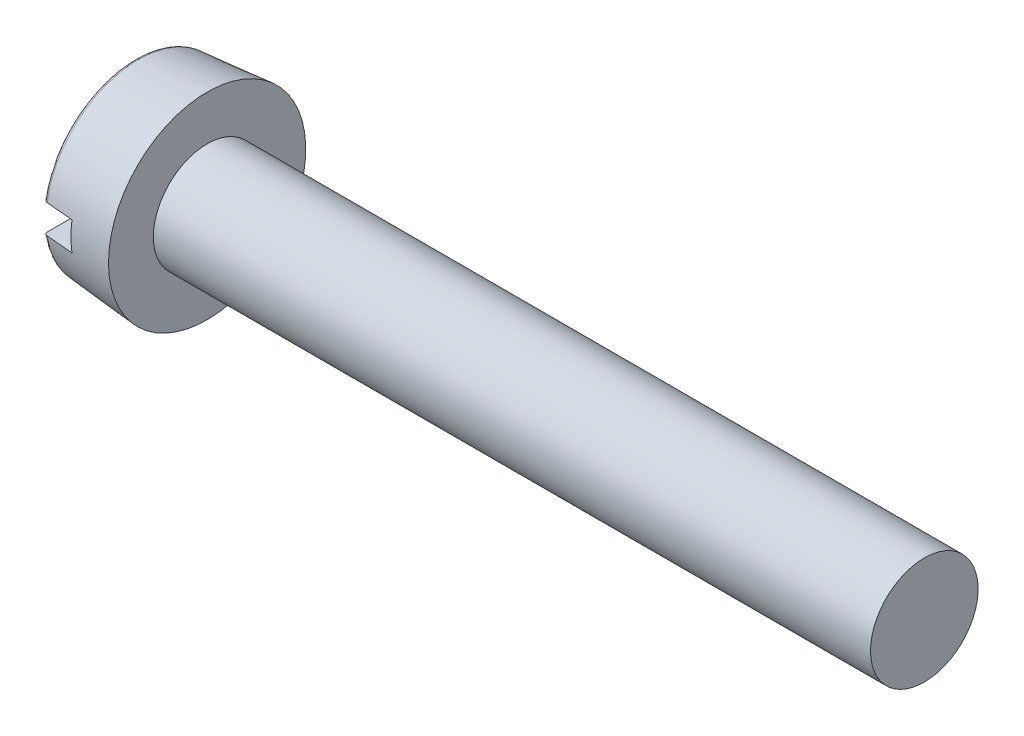
ISO-10303-21;
HEADER;
FILE_DESCRIPTION(('STEP AP214'),'2;1');
FILE_NAME('part.step','',(''),(''),'','','');
FILE_SCHEMA(('AUTOMOTIVE_DESIGN { 1 0 10303 214 1 1 1 1 }'));
ENDSEC;
DATA;
#1=APPLICATION_CONTEXT('core data for automotive mechanical design processes');
#2=APPLICATION_PROTOCOL_DEFINITION('international standard','automotive_design',2000,#1);
#3=PRODUCT_CONTEXT('',#1,'mechanical');
#4=PRODUCT('Part','Part','',(#3));
#5=PRODUCT_RELATED_PRODUCT_CATEGORY('part','',(#4));
#6=PRODUCT_DEFINITION_FORMATION('','',#4);
#7=PRODUCT_DEFINITION_CONTEXT('part definition',#1,'design');
#8=PRODUCT_DEFINITION('design','',#6,#7);
#9=PRODUCT_DEFINITION_SHAPE('','',#8);
#10=(LENGTH_UNIT() NAMED_UNIT(*) SI_UNIT(.MILLI.,.METRE.));
#11=(NAMED_UNIT(*) PLANE_ANGLE_UNIT() SI_UNIT($,.RADIAN.));
#12=(NAMED_UNIT(*) SI_UNIT($,.STERADIAN.) SOLID_ANGLE_UNIT());
#13=UNCERTAINTY_MEASURE_WITH_UNIT(LENGTH_MEASURE(1.E-05),#10,'distance_accuracy_value','');
#14=(GEOMETRIC_REPRESENTATION_CONTEXT(3) GLOBAL_UNCERTAINTY_ASSIGNED_CONTEXT((#13)) GLOBAL_UNIT_ASSIGNED_CONTEXT((#10,
#11,#12)) REPRESENTATION_CONTEXT('',''));
#15=CARTESIAN_POINT('',(0.,0.,0.));
#16=DIRECTION('',(0.,0.,1.));
#17=DIRECTION('',(1.,0.,0.));
#18=AXIS2_PLACEMENT_3D('',#15,#16,#17);
#19=CARTESIAN_POINT('',(0.,0.,0.));
#20=DIRECTION('',(-1.,0.,0.));
#21=DIRECTION('',(0.,0.,1.));
#22=AXIS2_PLACEMENT_3D('',#19,#20,#21);
#23=PLANE('',#22);
#24=DIRECTION('',(0.,0.,-1.));
#25=VECTOR('',#24,1.);
#26=CARTESIAN_POINT('',(0.,0.4,2.75));
#27=LINE('',#26,#25);
#28=CARTESIAN_POINT('',(0.,0.4,2.45096382768025));
#29=VERTEX_POINT('',#28);
#30=CARTESIAN_POINT('',(0.,0.4,-2.45096382768025));
#31=VERTEX_POINT('',#30);
#32=EDGE_CURVE('E84',#29,#31,#27,.T.);
#33=ORIENTED_EDGE('',*,*,#32,.F.);
#34=CARTESIAN_POINT('',(0.,0.,0.));
#35=DIRECTION('',(-1.,0.,0.));
#36=DIRECTION('',(0.,0.,1.));
#37=AXIS2_PLACEMENT_3D('',#34,#35,#36);
#38=CIRCLE('',#37,2.48338955554641);
#39=EDGE_CURVE('E86',#29,#31,#38,.T.);
#40=ORIENTED_EDGE('',*,*,#39,.T.);
#41=EDGE_LOOP('',(#33,#40));
#42=FACE_BOUND('',#41,.T.);
#43=ADVANCED_FACE('F16',(#42),#23,.T.);
#44=CARTESIAN_POINT('',(0.1,0.,0.));
#45=DIRECTION('',(-1.,0.,0.));
#46=DIRECTION('',(0.,0.,1.));
#47=AXIS2_PLACEMENT_3D('',#44,#45,#46);
#48=TOROIDAL_SURFACE('',#47,2.48338955554641,0.1);
#49=CARTESIAN_POINT('',(0.0289938380211766,0.4,-2.52228316549766));
#50=CARTESIAN_POINT('',(0.032914640039902,0.4,-2.52628601737879));
#51=CARTESIAN_POINT('',(0.0371732059087856,0.4,-2.52996330795833));
#52=CARTESIAN_POINT('',(0.0462494374841119,0.4,-2.53655558833691));
#53=CARTESIAN_POINT('',(0.0510676904570532,0.4,-2.53946976679746));
#54=CARTESIAN_POINT('',(0.0611266188974552,0.4,-2.54444525866304));
#55=CARTESIAN_POINT('',(0.0663672780390153,0.4,-2.54650660501096));
#56=CARTESIAN_POINT('',(0.0771205298537036,0.4,-2.54971287140411));
#57=CARTESIAN_POINT('',(0.0826330564249982,0.4,-2.55085801306043));
#58=CARTESIAN_POINT('',(0.0937360108304335,0.4,-2.55219318080891));
#59=CARTESIAN_POINT('',(0.0993256947509513,0.4,-2.55238939597481));
#60=CARTESIAN_POINT('',(0.110458306622039,0.4,-2.55183747650024));
#61=CARTESIAN_POINT('',(0.116001234198318,0.4,-2.55108933430727));
#62=CARTESIAN_POINT('',(0.126865819783631,0.4,-2.54867516285271));
#63=CARTESIAN_POINT('',(0.132188090847036,0.4,-2.54701188972794));
#64=CARTESIAN_POINT('',(0.142479668135714,0.4,-2.54281935144472));
#65=CARTESIAN_POINT('',(0.147448970444547,0.4,-2.54029007667919));
#66=CARTESIAN_POINT('',(0.156919019556884,0.4,-2.53442699567865));
#67=CARTESIAN_POINT('',(0.161417530686885,0.4,-2.53108957986598));
#68=CARTESIAN_POINT('',(0.169797583318729,0.4,-2.52371398467404));
#69=CARTESIAN_POINT('',(0.173679096427556,0.4,-2.51967577306341));
#70=CARTESIAN_POINT('',(0.180758379631839,0.4,-2.51096934806693));
#71=CARTESIAN_POINT('',(0.183948691710374,0.4,-2.50629507144611));
#72=CARTESIAN_POINT('',(0.189510239570672,0.4,-2.49648236653712));
#73=CARTESIAN_POINT('',(0.191881421883503,0.4,-2.49134390797695));
#74=CARTESIAN_POINT('',(0.195767027940458,0.4,-2.480682205207));
#75=CARTESIAN_POINT('',(0.197270760971854,0.4,-2.47515506403468));
#76=CARTESIAN_POINT('',(0.199338128353477,0.4,-2.46392763420021));
#77=CARTESIAN_POINT('',(0.199901709526226,0.4,-2.45822733576239));
#78=CARTESIAN_POINT('',(0.20007548133907,0.4,-2.44676112412241));
#79=CARTESIAN_POINT('',(0.199677113345941,0.4,-2.44099507954687));
#80=CARTESIAN_POINT('',(0.197919889661746,0.4,-2.42961109138142));
#81=CARTESIAN_POINT('',(0.196561010768147,0.4,-2.42399315137259));
#82=CARTESIAN_POINT('',(0.192915627153958,0.4,-2.41305590565846));
#83=CARTESIAN_POINT('',(0.190627555523931,0.4,-2.40773712175832));
#84=CARTESIAN_POINT('',(0.185185000915826,0.4,-2.39756279520368));
#85=CARTESIAN_POINT('',(0.182030540035585,0.4,-2.39270724073845));
#86=CARTESIAN_POINT('',(0.174965864483063,0.4,-2.38363467595376));
#87=CARTESIAN_POINT('',(0.171060998294418,0.4,-2.37941350258364));
#88=CARTESIAN_POINT('',(0.162589830789105,0.4,-2.37169707517616));
#89=CARTESIAN_POINT('',(0.158023574903145,0.4,-2.36820177131907));
#90=CARTESIAN_POINT('',(0.148421596079081,0.4,-2.36208459946197));
#91=CARTESIAN_POINT('',(0.143392636404649,0.4,-2.35945211619945));
#92=CARTESIAN_POINT('',(0.132960042691405,0.4,-2.35508144798975));
#93=CARTESIAN_POINT('',(0.127556438263746,0.4,-2.35334319245586));
#94=CARTESIAN_POINT('',(0.116602502745338,0.4,-2.35083201602087));
#95=CARTESIAN_POINT('',(0.111054942498253,0.4,-2.35004699968965));
#96=CARTESIAN_POINT('',(0.0999070705254333,0.4,-2.3494263065429));
#97=CARTESIAN_POINT('',(0.0943067613611995,0.4,-2.34959058386431));
#98=CARTESIAN_POINT('',(0.0832511443149568,0.4,-2.35085902950957));
#99=CARTESIAN_POINT('',(0.0777951256899433,0.4,-2.3519570180145));
#100=CARTESIAN_POINT('',(0.0671440893672219,0.4,-2.35505088710293));
#101=CARTESIAN_POINT('',(0.0619490721184735,0.4,-2.35704676923085));
#102=CARTESIAN_POINT('',(0.0519500535749679,0.4,-2.36188301447906));
#103=CARTESIAN_POINT('',(0.0471472182076573,0.4,-2.36472578664258));
#104=CARTESIAN_POINT('',(0.0380802947550975,0.4,-2.37116917771983));
#105=CARTESIAN_POINT('',(0.0338162339656361,0.4,-2.37476983500548));
#106=CARTESIAN_POINT('',(0.0258978392798653,0.4,-2.38266730942151));
#107=CARTESIAN_POINT('',(0.0222505790304377,0.4,-2.38697121737475));
#108=CARTESIAN_POINT('',(0.0157188388686001,0.4,-2.39612333377568));
#109=CARTESIAN_POINT('',(0.0128344147286457,0.4,-2.40097158198427));
#110=CARTESIAN_POINT('',(0.00786953684593836,0.4,-2.41114518595604));
#111=CARTESIAN_POINT('',(0.00580049504437296,0.4,-2.41647611188959));
#112=CARTESIAN_POINT('',(0.00257668282239865,0.4,-2.4274074136993));
#113=CARTESIAN_POINT('',(0.00142193421228851,0.4,-2.43300779599991));
#114=CARTESIAN_POINT('',(4.98309082449457E-05,0.4,-2.44437919860998));
#115=CARTESIAN_POINT('',(-0.000158040154989211,0.4,-2.45015136490808));
#116=CARTESIAN_POINT('',(0.000395629680354006,0.4,-2.46165070249477));
#117=CARTESIAN_POINT('',(0.00115743264880565,0.4,-2.46737786119837));
#118=CARTESIAN_POINT('',(0.00363465605126301,0.4,-2.47863907342415));
#119=CARTESIAN_POINT('',(0.00535281370349942,0.4,-2.48417252398631));
#120=CARTESIAN_POINT('',(0.00969850669250341,0.4,-2.49486489969062));
#121=CARTESIAN_POINT('',(0.0123249394519198,0.4,-2.50002426979425));
#122=CARTESIAN_POINT('',(0.0173136943959977,0.4,-2.50805181152184));
#123=CARTESIAN_POINT('',(0.0194300826406187,0.4,-2.51107561025655));
#124=CARTESIAN_POINT('',(0.0239801784125783,0.4,-2.51687431501129));
#125=CARTESIAN_POINT('',(0.0264138847052193,0.4,-2.5196492219997));
#126=CARTESIAN_POINT('',(0.0289938380211766,0.4,-2.52228316549766));
#127=B_SPLINE_CURVE_WITH_KNOTS('',3,(#49,#50,#51,#52,#53,#54,#55,#56,#57,#58,#59,#60,#61,#62,
#63,#64,#65,#66,#67,#68,#69,#70,#71,#72,#73,#74,#75,#76,#77,#78,#79,#80,#81,#82,#83,#84,#85,#86,
#87,#88,#89,#90,#91,#92,#93,#94,#95,#96,#97,#98,#99,#100,#101,#102,#103,#104,#105,#106,#107,
#108,#109,#110,#111,#112,#113,#114,#115,#116,#117,#118,#119,#120,#121,#122,#123,#124,#125,#126),
.UNSPECIFIED.,.T.,.F.,(4,2,2,2,2,2,2,2,2,2,2,2,2,2,2,2,2,2,2,2,2,2,2,2,2,2,2,2,2,2,2,2,2,2,2,2,
2,2,4),(0.,0.0167962438770803,0.0336102736228911,0.0504236538216827,0.0672329659785205,
0.0839324954656507,0.100632158508099,0.117281799647171,0.133931625497133,0.1506572362149,
0.167383616389183,0.184282358747596,0.201182203967945,0.21828610781718,0.235390979075727,
0.25264859529084,0.26990662840296,0.287193885606235,0.304480701927408,0.321648593971807,
0.338815307316333,0.355762112546915,0.372707579860328,0.389435704571818,0.406163021107001,
0.422780481006367,0.439397969489149,0.456063186523277,0.472729247524452,0.48957509386297,
0.506422171494335,0.523497308438321,0.54057285269434,0.557819049576413,0.575069908508115,
0.592370397548949,0.609649958399182,0.620702210843322,0.631754420283979),.UNSPECIFIED.);
#128=CARTESIAN_POINT('',(0.0912844257252334,0.4,-2.5518494518816));
#129=VERTEX_POINT('',#128);
#130=EDGE_CURVE('E40',#31,#129,#127,.T.);
#131=ORIENTED_EDGE('',*,*,#130,.F.);
#132=ORIENTED_EDGE('',*,*,#39,.F.);
#133=CARTESIAN_POINT('',(0.0367676987021641,0.4,2.37243473528728));
#134=CARTESIAN_POINT('',(0.0410691072562519,0.4,2.36887462682049));
#135=CARTESIAN_POINT('',(0.0456712476146376,0.4,2.36567202074306));
#136=CARTESIAN_POINT('',(0.0553504912178815,0.4,2.36008032650184));
#137=CARTESIAN_POINT('',(0.0604280839551126,0.4,2.35769208875703));
#138=CARTESIAN_POINT('',(0.0709135886904194,0.4,2.35380489827384));
#139=CARTESIAN_POINT('',(0.0763214938192328,0.4,2.35230592704897));
#140=CARTESIAN_POINT('',(0.0873116719417476,0.4,2.35024450872371));
#141=CARTESIAN_POINT('',(0.0928939027986413,0.4,2.34968183706536));
#142=CARTESIAN_POINT('',(0.104036601297581,0.4,2.34951039508072));
#143=CARTESIAN_POINT('',(0.109596974662459,0.4,2.34989545024077));
#144=CARTESIAN_POINT('',(0.120573920357346,0.4,2.35159460899385));
#145=CARTESIAN_POINT('',(0.125990490202902,0.4,2.35290872862725));
#146=CARTESIAN_POINT('',(0.13652239124753,0.4,2.35642416504568));
#147=CARTESIAN_POINT('',(0.141637967615106,0.4,2.35862474798459));
#148=CARTESIAN_POINT('',(0.151431222534294,0.4,2.36384674458521));
#149=CARTESIAN_POINT('',(0.156108887376012,0.4,2.3668681839343));
#150=CARTESIAN_POINT('',(0.164936002938918,0.4,2.37367095440966));
#151=CARTESIAN_POINT('',(0.16908079389346,0.4,2.3774583297866));
#152=CARTESIAN_POINT('',(0.176685910750913,0.4,2.38566704388047));
#153=CARTESIAN_POINT('',(0.180146192360979,0.4,2.39008842359028));
#154=CARTESIAN_POINT('',(0.186332746435633,0.4,2.39950205527751));
#155=CARTESIAN_POINT('',(0.189048713902265,0.4,2.40450107962601));
#156=CARTESIAN_POINT('',(0.193614409893134,0.4,2.41488017557624));
#157=CARTESIAN_POINT('',(0.195464077650946,0.4,2.42026027387786));
#158=CARTESIAN_POINT('',(0.19826623133481,0.4,2.43131856240102));
#159=CARTESIAN_POINT('',(0.199207620171234,0.4,2.43699956654937));
#160=CARTESIAN_POINT('',(0.20012925691986,0.4,2.4484391128062));
#161=CARTESIAN_POINT('',(0.200109464431672,0.4,2.45419765816372));
#162=CARTESIAN_POINT('',(0.199105792419158,0.4,2.46566309979117));
#163=CARTESIAN_POINT('',(0.198116473192368,0.4,2.47136952123461));
#164=CARTESIAN_POINT('',(0.195191128966346,0.4,2.48253449565388));
#165=CARTESIAN_POINT('',(0.193255106776879,0.4,2.48799304936533));
#166=CARTESIAN_POINT('',(0.188494675278442,0.4,2.49848893070217));
#167=CARTESIAN_POINT('',(0.185672880951563,0.4,2.50352744366316));
#168=CARTESIAN_POINT('',(0.179215498557441,0.4,2.51305299197626));
#169=CARTESIAN_POINT('',(0.175579948629359,0.4,2.51754005315861));
#170=CARTESIAN_POINT('',(0.167635478825506,0.4,2.52578731588122));
#171=CARTESIAN_POINT('',(0.163333512373972,0.4,2.5295542142048));
#172=CARTESIAN_POINT('',(0.154151555490121,0.4,2.53630156216166));
#173=CARTESIAN_POINT('',(0.149271604711319,0.4,2.53928206570155));
#174=CARTESIAN_POINT('',(0.13913635307135,0.4,2.54433379308572));
#175=CARTESIAN_POINT('',(0.133886369113007,0.4,2.54641568563766));
#176=CARTESIAN_POINT('',(0.123109394747461,0.4,2.54965893225548));
#177=CARTESIAN_POINT('',(0.117582421034199,0.4,2.55082034172732));
#178=CARTESIAN_POINT('',(0.106464698916145,0.4,2.55218028189334));
#179=CARTESIAN_POINT('',(0.100875054594367,0.4,2.55238785185234));
#180=CARTESIAN_POINT('',(0.0897407847209889,0.4,2.55185843737952));
#181=CARTESIAN_POINT('',(0.0841961579348971,0.4,2.55112147893765));
#182=CARTESIAN_POINT('',(0.0733265657266894,0.4,2.54872918263962));
#183=CARTESIAN_POINT('',(0.0680009847337698,0.4,2.54707663871122));
#184=CARTESIAN_POINT('',(0.0577010526378298,0.4,2.54290481605141));
#185=CARTESIAN_POINT('',(0.0527267057044028,0.4,2.54038552703274));
#186=CARTESIAN_POINT('',(0.0432451955154216,0.4,2.53454156724995));
#187=CARTESIAN_POINT('',(0.0387402389480656,0.4,2.53121331773258));
#188=CARTESIAN_POINT('',(0.0303458654217713,0.4,2.52385482922166));
#189=CARTESIAN_POINT('',(0.0264564786942822,0.4,2.51982455577117));
#190=CARTESIAN_POINT('',(0.0193602742266984,0.4,2.51113277232454));
#191=CARTESIAN_POINT('',(0.0161608831052445,0.4,2.50646520000313));
#192=CARTESIAN_POINT('',(0.0105801862776831,0.4,2.49666430232761));
#193=CARTESIAN_POINT('',(0.0081989347764834,0.4,2.491530946142));
#194=CARTESIAN_POINT('',(0.00429230007908613,0.4,2.48087765570879));
#195=CARTESIAN_POINT('',(0.00277761888662436,0.4,2.47535379620009));
#196=CARTESIAN_POINT('',(0.000687995440566799,0.4,2.46413127035624));
#197=CARTESIAN_POINT('',(0.0001130708922124,0.4,2.45843260072968));
#198=CARTESIAN_POINT('',(-8.37002456024794E-05,0.4,2.44696818040157));
#199=CARTESIAN_POINT('',(0.000302941335767494,0.4,2.44120228266165));
#200=CARTESIAN_POINT('',(0.00203701001733551,0.4,2.42981508207598));
#201=CARTESIAN_POINT('',(0.00338469494754019,0.4,2.42419381845226));
#202=CARTESIAN_POINT('',(0.00700896577894959,0.4,2.41324562761761));
#203=CARTESIAN_POINT('',(0.00928760515722993,0.4,2.40791938083122));
#204=CARTESIAN_POINT('',(0.0147114792186618,0.4,2.39773348978099));
#205=CARTESIAN_POINT('',(0.0178556585516143,0.4,2.39287328693997));
#206=CARTESIAN_POINT('',(0.0236503626604919,0.4,2.38539954815907));
#207=CARTESIAN_POINT('',(0.0260726096208587,0.4,2.38260604033144));
#208=CARTESIAN_POINT('',(0.031208607808559,0.4,2.37730112356));
#209=CARTESIAN_POINT('',(0.0339223576900257,0.4,2.37478971331387));
#210=CARTESIAN_POINT('',(0.0367676987021641,0.4,2.37243473528728));
#211=B_SPLINE_CURVE_WITH_KNOTS('',3,(#133,#134,#135,#136,#137,#138,#139,#140,#141,#142,#143,
#144,#145,#146,#147,#148,#149,#150,#151,#152,#153,#154,#155,#156,#157,#158,#159,#160,#161,#162,
#163,#164,#165,#166,#167,#168,#169,#170,#171,#172,#173,#174,#175,#176,#177,#178,#179,#180,#181,
#182,#183,#184,#185,#186,#187,#188,#189,#190,#191,#192,#193,#194,#195,#196,#197,#198,#199,#200,
#201,#202,#203,#204,#205,#206,#207,#208,#209,#210),.UNSPECIFIED.,.T.,.F.,(4,2,2,2,2,2,2,2,2,2,2,
2,2,2,2,2,2,2,2,2,2,2,2,2,2,2,2,2,2,2,2,2,2,2,2,2,2,2,4),(0.,0.0167374978406363,
0.0334924209723814,0.0502469957829498,0.0669975516708034,0.0836392656129628,0.100281266882442,
0.116909519525705,0.133538292583204,0.15030380318579,0.167070398286949,0.184058579715982,
0.20104795259929,0.218242362613188,0.235437495343467,0.252729660021827,0.270021773378245,
0.287263309496308,0.304504037705845,0.321575685446242,0.338646162637363,0.35550798995053,
0.372368802234774,0.389069495340301,0.405769728913956,0.422419279849294,0.439069028402678,
0.455793818907913,0.47251943053503,0.489416954805599,0.506315598386584,0.523418666684379,
0.540522057204384,0.557776961903068,0.575036497513278,0.592334311120995,0.60961112626892,
0.620682873655479,0.631754569926061),.UNSPECIFIED.);
#212=CARTESIAN_POINT('',(0.0912844257243818,0.4,2.55184945188523));
#213=VERTEX_POINT('',#212);
#214=EDGE_CURVE('E76',#213,#29,#211,.T.);
#215=ORIENTED_EDGE('',*,*,#214,.F.);
#216=CARTESIAN_POINT('',(0.0912844257252333,0.,0.));
#217=DIRECTION('',(-1.,0.,0.));
#218=DIRECTION('',(0.,0.,1.));
#219=AXIS2_PLACEMENT_3D('',#216,#217,#218);
#220=CIRCLE('',#219,2.58300902535559);
#221=EDGE_CURVE('E90',#129,#213,#220,.F.);
#222=ORIENTED_EDGE('',*,*,#221,.F.);
#223=EDGE_LOOP('',(#131,#132,#215,#222));
#224=FACE_BOUND('',#223,.T.);
#225=ADVANCED_FACE('F167',(#224),#48,.T.);
#226=CARTESIAN_POINT('',(-25.4,0.,0.));
#227=DIRECTION('',(-1.,0.,0.));
#228=DIRECTION('',(0.,0.,1.));
#229=AXIS2_PLACEMENT_3D('',#226,#227,#228);
#230=CYLINDRICAL_SURFACE('',#229,1.5);
#231=CARTESIAN_POINT('',(22.,0.,0.));
#232=DIRECTION('',(-1.,0.,0.));
#233=DIRECTION('',(0.,0.,1.));
#234=AXIS2_PLACEMENT_3D('',#231,#232,#233);
#235=CIRCLE('',#234,1.5);
#236=CARTESIAN_POINT('',(22.,0.,1.5));
#237=VERTEX_POINT('',#236);
#238=EDGE_CURVE('E87',#237,#237,#235,.T.);
#239=ORIENTED_EDGE('',*,*,#238,.T.);
#240=EDGE_LOOP('',(#239));
#241=FACE_BOUND('',#240,.T.);
#242=CARTESIAN_POINT('',(2.,0.,0.));
#243=DIRECTION('',(-1.,0.,0.));
#244=DIRECTION('',(0.,0.,1.));
#245=AXIS2_PLACEMENT_3D('',#242,#243,#244);
#246=CIRCLE('',#245,1.5);
#247=CARTESIAN_POINT('',(2.,0.,1.5));
#248=VERTEX_POINT('',#247);
#249=EDGE_CURVE('E154',#248,#248,#246,.T.);
#250=ORIENTED_EDGE('',*,*,#249,.F.);
#251=EDGE_LOOP('',(#250));
#252=FACE_BOUND('',#251,.T.);
#253=ADVANCED_FACE('F164',(#241,#252),#230,.T.);
#254=CARTESIAN_POINT('',(22.,1.5,0.));
#255=DIRECTION('',(1.,0.,0.));
#256=DIRECTION('',(0.,0.,-1.));
#257=AXIS2_PLACEMENT_3D('',#254,#255,#256);
#258=PLANE('',#257);
#259=ORIENTED_EDGE('',*,*,#238,.F.);
#260=EDGE_LOOP('',(#259));
#261=FACE_BOUND('',#260,.T.);
#262=ADVANCED_FACE('F166',(#261),#258,.T.);
#263=DIRECTION('',(0.,0.,1.));
#264=VECTOR('',#263,1.);
#265=CARTESIAN_POINT('',(0.,-0.4,-2.75));
#266=LINE('',#265,#264);
#267=CARTESIAN_POINT('',(0.,-0.4,-2.45096382768025));
#268=VERTEX_POINT('',#267);
#269=CARTESIAN_POINT('',(0.,-0.4,2.45096382768025));
#270=VERTEX_POINT('',#269);
#271=EDGE_CURVE('E32',#268,#270,#266,.T.);
#272=ORIENTED_EDGE('',*,*,#271,.F.);
#273=EDGE_CURVE('E82',#268,#270,#38,.T.);
#274=ORIENTED_EDGE('',*,*,#273,.T.);
#275=EDGE_LOOP('',(#272,#274));
#276=FACE_BOUND('',#275,.T.);
#277=ADVANCED_FACE('F81',(#276),#23,.T.);
#278=CARTESIAN_POINT('',(0.,0.,0.));
#279=DIRECTION('',(1.,0.,0.));
#280=DIRECTION('',(0.,0.,-1.));
#281=AXIS2_PLACEMENT_3D('',#278,#279,#280);
#282=CONICAL_SURFACE('',#281,2.57502267294815,0.0872664625997163);
#283=CARTESIAN_POINT('',(5.21123588736544,0.4,3.00443640584799));
#284=CARTESIAN_POINT('',(4.41342358696223,0.4,2.93401988873196));
#285=CARTESIAN_POINT('',(3.61561486907634,0.4,2.86356274948076));
#286=CARTESIAN_POINT('',(2.0200069246513,0.4,2.72254136292326));
#287=CARTESIAN_POINT('',(1.22220769811185,0.4,2.65197711562021));
#288=CARTESIAN_POINT('',(-0.373378996688641,0.4,2.51071564393346));
#289=CARTESIAN_POINT('',(-1.17116646494953,0.4,2.44001841954794));
#290=CARTESIAN_POINT('',(-2.76672581923324,0.4,2.29844809218199));
#291=CARTESIAN_POINT('',(-3.56449770525557,0.4,2.22757498919617));
#292=CARTESIAN_POINT('',(-4.36225986914578,0.4,2.15659249784001));
#293=B_SPLINE_CURVE_WITH_KNOTS('',3,(#283,#284,#285,#286,#287,#288,#289,#290,#291,#292),
.UNSPECIFIED.,.F.,.F.,(4,2,2,2,4),(0.,2.40274147318215,4.80548287330205,7.20822430613117,
9.6109658126378),.UNSPECIFIED.);
#294=CARTESIAN_POINT('',(0.85,0.4,2.61901832187334));
#295=VERTEX_POINT('',#294);
#296=EDGE_CURVE('E143',#295,#213,#293,.T.);
#297=ORIENTED_EDGE('',*,*,#296,.F.);
#298=CARTESIAN_POINT('',(0.85,0.,0.));
#299=DIRECTION('',(1.,0.,0.));
#300=DIRECTION('',(0.,0.,-1.));
#301=AXIS2_PLACEMENT_3D('',#298,#299,#300);
#302=CIRCLE('',#301,2.64938803694518);
#303=CARTESIAN_POINT('',(0.85,-0.4,2.61901832187334));
#304=VERTEX_POINT('',#303);
#305=EDGE_CURVE('E11',#304,#295,#302,.F.);
#306=ORIENTED_EDGE('',*,*,#305,.F.);
#307=CARTESIAN_POINT('',(-4.36225986914578,-0.4,2.15659249784001));
#308=CARTESIAN_POINT('',(-3.02252879329929,-0.4,2.27578971400985));
#309=CARTESIAN_POINT('',(-1.68277158070832,-0.4,2.39469248552581));
#310=CARTESIAN_POINT('',(-0.0871929715729534,-0.4,2.5360455579839));
#311=CARTESIAN_POINT('',(0.168610376643268,-0.4,2.55869953286896));
#312=CARTESIAN_POINT('',(2.02000114161503,-0.4,2.72260692865391));
#313=CARTESIAN_POINT('',(3.61561248830954,-0.4,2.86359016848938));
#314=CARTESIAN_POINT('',(5.21123588736544,-0.4,3.00443640584799));
#315=B_SPLINE_CURVE_WITH_KNOTS('',3,(#307,#308,#309,#310,#311,#312,#313,#314),.UNSPECIFIED.,.F.,
.F.,(4,2,2,4),(0.,4.03506939923899,4.80548292410975,9.61096578658458),.UNSPECIFIED.);
#316=CARTESIAN_POINT('',(0.0912844257241123,-0.4,2.55184945188158));
#317=VERTEX_POINT('',#316);
#318=EDGE_CURVE('E119',#317,#304,#315,.T.);
#319=ORIENTED_EDGE('',*,*,#318,.F.);
#320=CARTESIAN_POINT('',(0.0912844257452064,-0.4,-2.55184945199817));
#321=VERTEX_POINT('',#320);
#322=EDGE_CURVE('E96',#317,#321,#220,.F.);
#323=ORIENTED_EDGE('',*,*,#322,.T.);
#324=CARTESIAN_POINT('',(5.21123588736544,-0.4,-3.00443640584799));
#325=CARTESIAN_POINT('',(4.41342358696223,-0.4,-2.93401988873196));
#326=CARTESIAN_POINT('',(3.61561486907634,-0.4,-2.86356274948076));
#327=CARTESIAN_POINT('',(2.0200069246513,-0.4,-2.72254136292326));
#328=CARTESIAN_POINT('',(1.22220769811185,-0.4,-2.65197711562021));
#329=CARTESIAN_POINT('',(-0.373378996688641,-0.4,-2.51071564393346));
#330=CARTESIAN_POINT('',(-1.17116646494953,-0.4,-2.44001841954794));
#331=CARTESIAN_POINT('',(-2.76672581923324,-0.4,-2.29844809218199));
#332=CARTESIAN_POINT('',(-3.56449770525557,-0.4,-2.22757498919617));
#333=CARTESIAN_POINT('',(-4.36225986914578,-0.4,-2.15659249784001));
#334=B_SPLINE_CURVE_WITH_KNOTS('',3,(#324,#325,#326,#327,#328,#329,#330,#331,#332,#333),
.UNSPECIFIED.,.F.,.F.,(4,2,2,2,4),(0.,2.40274147318215,4.80548287330205,7.20822430613117,
9.6109658126378),.UNSPECIFIED.);
#335=CARTESIAN_POINT('',(0.85,-0.4,-2.61901832187334));
#336=VERTEX_POINT('',#335);
#337=EDGE_CURVE('E71',#336,#321,#334,.T.);
#338=ORIENTED_EDGE('',*,*,#337,.F.);
#339=CARTESIAN_POINT('',(0.85,0.4,-2.61901832187334));
#340=VERTEX_POINT('',#339);
#341=EDGE_CURVE('E21',#340,#336,#302,.F.);
#342=ORIENTED_EDGE('',*,*,#341,.F.);
#343=CARTESIAN_POINT('',(-4.36225986914578,0.4,-2.15659249784001));
#344=CARTESIAN_POINT('',(-3.02252879329929,0.4,-2.27578971400985));
#345=CARTESIAN_POINT('',(-1.68277158070832,0.4,-2.39469248552581));
#346=CARTESIAN_POINT('',(-0.0871929715729534,0.4,-2.5360455579839));
#347=CARTESIAN_POINT('',(0.168610376643268,0.4,-2.55869953286896));
#348=CARTESIAN_POINT('',(2.02000114161503,0.4,-2.72260692865391));
#349=CARTESIAN_POINT('',(3.61561248830954,0.4,-2.86359016848938));
#350=CARTESIAN_POINT('',(5.21123588736544,0.4,-3.00443640584799));
#351=B_SPLINE_CURVE_WITH_KNOTS('',3,(#343,#344,#345,#346,#347,#348,#349,#350),.UNSPECIFIED.,.F.,
.F.,(4,2,2,4),(0.,4.03506939923899,4.80548292410975,9.61096578658458),.UNSPECIFIED.);
#352=EDGE_CURVE('E148',#129,#340,#351,.T.);
#353=ORIENTED_EDGE('',*,*,#352,.F.);
#354=ORIENTED_EDGE('',*,*,#221,.T.);
#355=EDGE_LOOP('',(#297,#306,#319,#323,#338,#342,#353,#354));
#356=FACE_BOUND('',#355,.T.);
#357=CARTESIAN_POINT('',(2.,0.,0.));
#358=DIRECTION('',(-1.,0.,0.));
#359=DIRECTION('',(0.,0.,1.));
#360=AXIS2_PLACEMENT_3D('',#357,#358,#359);
#361=CIRCLE('',#360,2.75);
#362=CARTESIAN_POINT('',(2.,0.,2.75));
#363=VERTEX_POINT('',#362);
#364=EDGE_CURVE('E92',#363,#363,#361,.T.);
#365=ORIENTED_EDGE('',*,*,#364,.T.);
#366=EDGE_LOOP('',(#365));
#367=FACE_BOUND('',#366,.T.);
#368=ADVANCED_FACE('F132',(#356,#367),#282,.T.);
#369=CARTESIAN_POINT('',(2.,1.5,0.));
#370=DIRECTION('',(-1.,0.,0.));
#371=DIRECTION('',(0.,0.,1.));
#372=AXIS2_PLACEMENT_3D('',#369,#370,#371);
#373=PLANE('',#372);
#374=ORIENTED_EDGE('',*,*,#364,.F.);
#375=EDGE_LOOP('',(#374));
#376=FACE_BOUND('',#375,.T.);
#377=ORIENTED_EDGE('',*,*,#249,.T.);
#378=EDGE_LOOP('',(#377));
#379=FACE_BOUND('',#378,.T.);
#380=ADVANCED_FACE('F136',(#376,#379),#373,.F.);
#381=CARTESIAN_POINT('',(0.0289938380211766,-0.4,-2.52228316549766));
#382=CARTESIAN_POINT('',(0.0250040691259329,-0.4,-2.51820918183003));
#383=CARTESIAN_POINT('',(0.0213583190112076,-0.4,-2.51379201367196));
#384=CARTESIAN_POINT('',(0.0148592785644242,-0.4,-2.50440306026762));
#385=CARTESIAN_POINT('',(0.0120070700796542,-0.4,-2.49943053069828));
#386=CARTESIAN_POINT('',(0.00717770347925544,-0.4,-2.48908271582266));
#387=CARTESIAN_POINT('',(0.00519971746694681,-0.4,-2.48370781723002));
#388=CARTESIAN_POINT('',(0.00216717495668296,-0.4,-2.47270542437941));
#389=CARTESIAN_POINT('',(0.00111238322136111,-0.4,-2.4670779948528));
#390=CARTESIAN_POINT('',(-5.25582059451325E-05,-0.4,-2.45568286085503));
#391=CARTESIAN_POINT('',(-0.000155467825421213,-0.4,-2.44991441534212));
#392=CARTESIAN_POINT('',(0.000604499959018029,-0.4,-2.43844109806143));
#393=CARTESIAN_POINT('',(0.00146745336414927,-0.4,-2.43273623133216));
#394=CARTESIAN_POINT('',(0.00414151157260908,-0.4,-2.42152987250594));
#395=CARTESIAN_POINT('',(0.00595623339048404,-0.4,-2.4160292425596));
#396=CARTESIAN_POINT('',(0.0104876390060394,-0.4,-2.40541275972393));
#397=CARTESIAN_POINT('',(0.0132043100000621,-0.4,-2.40029690137384));
#398=CARTESIAN_POINT('',(0.0194512493609944,-0.4,-2.39062289289039));
#399=CARTESIAN_POINT('',(0.0229775960031583,-0.4,-2.38606221159139));
#400=CARTESIAN_POINT('',(0.0307542280705694,-0.4,-2.37760643337986));
#401=CARTESIAN_POINT('',(0.0350044686960848,-0.4,-2.37371129530862));
#402=CARTESIAN_POINT('',(0.0440555019555715,-0.4,-2.36674703965411));
#403=CARTESIAN_POINT('',(0.0488492409468829,-0.4,-2.36366875652182));
#404=CARTESIAN_POINT('',(0.0588909820215894,-0.4,-2.3583735233016));
#405=CARTESIAN_POINT('',(0.0641389481441064,-0.4,-2.356156505104));
#406=CARTESIAN_POINT('',(0.0748640783279177,-0.4,-2.35267719664892));
#407=CARTESIAN_POINT('',(0.0803372009928278,-0.4,-2.35140244386474));
#408=CARTESIAN_POINT('',(0.0914202264447977,-0.4,-2.34979886854023));
#409=CARTESIAN_POINT('',(0.0970301209943427,-0.4,-2.34946998917295));
#410=CARTESIAN_POINT('',(0.108175670502412,-0.4,-2.34976708273981));
#411=CARTESIAN_POINT('',(0.113711547505789,-0.4,-2.35038480500947));
#412=CARTESIAN_POINT('',(0.124600906547843,-0.4,-2.35254069219937));
#413=CARTESIAN_POINT('',(0.129954390579144,-0.4,-2.35407884706056));
#414=CARTESIAN_POINT('',(0.140330562478324,-0.4,-2.35802931008484));
#415=CARTESIAN_POINT('',(0.145353122327478,-0.4,-2.36044195422667));
#416=CARTESIAN_POINT('',(0.154926879209598,-0.4,-2.36606888937863));
#417=CARTESIAN_POINT('',(0.159478058010392,-0.4,-2.36928321137984));
#418=CARTESIAN_POINT('',(0.168025501299986,-0.4,-2.37645214423981));
#419=CARTESIAN_POINT('',(0.172016319852357,-0.4,-2.38041324620994));
#420=CARTESIAN_POINT('',(0.179287042308477,-0.4,-2.3889414041015));
#421=CARTESIAN_POINT('',(0.182566897622745,-0.4,-2.3935085014042));
#422=CARTESIAN_POINT('',(0.188369159015881,-0.4,-2.40318459258693));
#423=CARTESIAN_POINT('',(0.190880811711646,-0.4,-2.40830003507254));
#424=CARTESIAN_POINT('',(0.195020891957927,-0.4,-2.41887665144677));
#425=CARTESIAN_POINT('',(0.196649260076485,-0.4,-2.42433784857194));
#426=CARTESIAN_POINT('',(0.198994072160014,-0.4,-2.43551846416644));
#427=CARTESIAN_POINT('',(0.199699802934894,-0.4,-2.44124013143329));
#428=CARTESIAN_POINT('',(0.200145599532922,-0.4,-2.45272108096227));
#429=CARTESIAN_POINT('',(0.199885628830452,-0.4,-2.45848036463892));
#430=CARTESIAN_POINT('',(0.198402716236481,-0.4,-2.46990089334109));
#431=CARTESIAN_POINT('',(0.197175332540679,-0.4,-2.47556156274737));
#432=CARTESIAN_POINT('',(0.193783964811842,-0.4,-2.48659519893132));
#433=CARTESIAN_POINT('',(0.191619990295666,-0.4,-2.49196816863173));
#434=CARTESIAN_POINT('',(0.18642349180956,-0.4,-2.5022498657427));
#435=CARTESIAN_POINT('',(0.183394426113029,-0.4,-2.50716034009667));
#436=CARTESIAN_POINT('',(0.176546746863083,-0.4,-2.51639609907409));
#437=CARTESIAN_POINT('',(0.172728172126222,-0.4,-2.52072141244993));
#438=CARTESIAN_POINT('',(0.164451603414079,-0.4,-2.52861521808819));
#439=CARTESIAN_POINT('',(0.160000663078317,-0.4,-2.5321911048007));
#440=CARTESIAN_POINT('',(0.150555440028444,-0.4,-2.53853392400498));
#441=CARTESIAN_POINT('',(0.145561193801724,-0.4,-2.54130091077496));
#442=CARTESIAN_POINT('',(0.135236369590602,-0.4,-2.54591243640717));
#443=CARTESIAN_POINT('',(0.129910608025948,-0.4,-2.54776776094683));
#444=CARTESIAN_POINT('',(0.119021928101676,-0.4,-2.55054885934361));
#445=CARTESIAN_POINT('',(0.113459032918955,-0.4,-2.55147472382786));
#446=CARTESIAN_POINT('',(0.10230719557154,-0.4,-2.55236453620601));
#447=CARTESIAN_POINT('',(0.0967189330552641,-0.4,-2.55233702605628));
#448=CARTESIAN_POINT('',(0.0856253047271062,-0.4,-2.55134185745125));
#449=CARTESIAN_POINT('',(0.080119958353241,-0.4,-2.55037398192564));
#450=CARTESIAN_POINT('',(0.0693593931696279,-0.4,-2.5475299876823));
#451=CARTESIAN_POINT('',(0.0641037847017825,-0.4,-2.54565533854207));
#452=CARTESIAN_POINT('',(0.0539843368990705,-0.4,-2.54105571590675));
#453=CARTESIAN_POINT('',(0.0491200334774602,-0.4,-2.53833176895425));
#454=CARTESIAN_POINT('',(0.041721087799713,-0.4,-2.53333714733838));
#455=CARTESIAN_POINT('',(0.0390206414531839,-0.4,-2.53130731123891));
#456=CARTESIAN_POINT('',(0.0338378944269704,-0.4,-2.5269861226631));
#457=CARTESIAN_POINT('',(0.0313555927448643,-0.4,-2.5246947713886));
#458=CARTESIAN_POINT('',(0.0289938380211766,-0.4,-2.52228316549766));
#459=B_SPLINE_CURVE_WITH_KNOTS('',3,(#381,#382,#383,#384,#385,#386,#387,#388,#389,#390,#391,
#392,#393,#394,#395,#396,#397,#398,#399,#400,#401,#402,#403,#404,#405,#406,#407,#408,#409,#410,
#411,#412,#413,#414,#415,#416,#417,#418,#419,#420,#421,#422,#423,#424,#425,#426,#427,#428,#429,
#430,#431,#432,#433,#434,#435,#436,#437,#438,#439,#440,#441,#442,#443,#444,#445,#446,#447,#448,
#449,#450,#451,#452,#453,#454,#455,#456,#457,#458),.UNSPECIFIED.,.T.,.F.,(4,2,2,2,2,2,2,2,2,2,2,
2,2,2,2,2,2,2,2,2,2,2,2,2,2,2,2,2,2,2,2,2,2,2,2,2,2,2,4),(0.,0.0170942392389231,
0.0342116703729639,0.0513128562267112,0.0684096832903571,0.0856364438942316,0.102864560121802,
0.120158628073264,0.137452450536548,0.154664213002622,0.171874910668649,0.188883439324026,
0.205890622654356,0.222668631829324,0.239445632980393,0.25607723380216,0.272708652867036,
0.289346468507186,0.305984927428092,0.322775300606072,0.339566820929855,0.356583638258369,
0.373601600424437,0.390815461144302,0.408029972948719,0.425323987595621,0.442617826519222,
0.459843477026103,0.477068280827684,0.494114170430569,0.511158915969803,0.527996838794438,
0.54483311967548,0.561518591762545,0.578207916374963,0.594870283327563,0.611512588116953,
0.621631616777719,0.631750598936937),.UNSPECIFIED.);
#460=EDGE_CURVE('E67',#321,#268,#459,.T.);
#461=ORIENTED_EDGE('',*,*,#460,.F.);
#462=ORIENTED_EDGE('',*,*,#322,.F.);
#463=CARTESIAN_POINT('',(0.0367676987021641,-0.4,2.37243473528728));
#464=CARTESIAN_POINT('',(0.0323825993918226,-0.4,2.376064766641));
#465=CARTESIAN_POINT('',(0.0283037127586663,-0.400000000000001,2.38007177408389));
#466=CARTESIAN_POINT('',(0.0208754097236721,-0.400000000000001,2.38871904036559));
#467=CARTESIAN_POINT('',(0.0175270033246335,-0.4,2.3933601617357));
#468=CARTESIAN_POINT('',(0.0116570776320304,-0.4,2.40313270602566));
#469=CARTESIAN_POINT('',(0.00913472821970483,-0.400000000000001,2.40826362999444));
#470=CARTESIAN_POINT('',(0.00497968232768614,-0.400000000000001,2.41887190213892));
#471=CARTESIAN_POINT('',(0.00334675788140135,-0.4,2.42434916114416));
#472=CARTESIAN_POINT('',(0.00100169668541078,-0.4,2.43554641737224));
#473=CARTESIAN_POINT('',(0.000297555212990519,-0.400000000000001,2.44126809010382));
#474=CARTESIAN_POINT('',(-0.000145121663011668,-0.400000000000001,2.45274905375029));
#475=CARTESIAN_POINT('',(0.000116421789298106,-0.4,2.45850834769892));
#476=CARTESIAN_POINT('',(0.0016024730883371,-0.4,2.46992855294402));
#477=CARTESIAN_POINT('',(0.0028314104504488,-0.400000000000001,2.47558888896036));
#478=CARTESIAN_POINT('',(0.00622581243878595,-0.400000000000001,2.486621594425));
#479=CARTESIAN_POINT('',(0.00839126662820595,-0.4,2.49199396708169));
#480=CARTESIAN_POINT('',(0.0135905931181134,-0.4,2.5022742049996));
#481=CARTESIAN_POINT('',(0.0166210040147385,-0.400000000000001,2.50718381998701));
#482=CARTESIAN_POINT('',(0.02347119874798,-0.400000000000001,2.51641762191268));
#483=CARTESIAN_POINT('',(0.0272909405744301,-0.4,2.52074183998697));
#484=CARTESIAN_POINT('',(0.0355696248224722,-0.4,2.52863327794772));
#485=CARTESIAN_POINT('',(0.0400215149384818,-0.400000000000001,2.53220789499491));
#486=CARTESIAN_POINT('',(0.0494684030939913,-0.400000000000001,2.53854802988593));
#487=CARTESIAN_POINT('',(0.0544633641997854,-0.4,2.54131360270489));
#488=CARTESIAN_POINT('',(0.064789263032711,-0.4,2.54592217430933));
#489=CARTESIAN_POINT('',(0.0701153800428131,-0.400000000000001,2.54777597641343));
#490=CARTESIAN_POINT('',(0.0810047128387973,-0.400000000000001,2.5505540786382));
#491=CARTESIAN_POINT('',(0.0865679149637752,-0.4,2.55147843223863));
#492=CARTESIAN_POINT('',(0.0977207563531531,-0.4,2.55236521435314));
#493=CARTESIAN_POINT('',(0.103309726295532,-0.400000000000001,2.55233608070093));
#494=CARTESIAN_POINT('',(0.114402937889976,-0.400000000000001,2.55133769001562));
#495=CARTESIAN_POINT('',(0.119907181471709,-0.4,2.55036845442587));
#496=CARTESIAN_POINT('',(0.130663236148904,-0.4,2.54752235629068));
#497=CARTESIAN_POINT('',(0.135915551335543,-0.400000000000001,2.54564739710644));
#498=CARTESIAN_POINT('',(0.146033240425047,-0.400000000000001,2.54104687692432));
#499=CARTESIAN_POINT('',(0.150898607454475,-0.4,2.53832130082098));
#500=CARTESIAN_POINT('',(0.160133532834313,-0.4,2.53208305631211));
#501=CARTESIAN_POINT('',(0.164500283568366,-0.400000000000001,2.5285662331518));
#502=CARTESIAN_POINT('',(0.172589200308648,-0.400000000000001,2.52085649868401));
#503=CARTESIAN_POINT('',(0.176311333654103,-0.4,2.51666355314026));
#504=CARTESIAN_POINT('',(0.183048642136847,-0.4,2.50767286712186));
#505=CARTESIAN_POINT('',(0.186055783056341,-0.400000000000001,2.50286910685156));
#506=CARTESIAN_POINT('',(0.191231971525039,-0.400000000000001,2.49282955053378));
#507=CARTESIAN_POINT('',(0.193400964848264,-0.4,2.48759372655948));
#508=CARTESIAN_POINT('',(0.196865823745477,-0.4,2.47677152916927));
#509=CARTESIAN_POINT('',(0.19815093646314,-0.400000000000001,2.4711817121246));
#510=CARTESIAN_POINT('',(0.199773012529528,-0.400000000000001,2.4598661010716));
#511=CARTESIAN_POINT('',(0.200109924006275,-0.4,2.45414029964144));
#512=CARTESIAN_POINT('',(0.199826178778735,-0.4,2.44266501865172));
#513=CARTESIAN_POINT('',(0.199197601251489,-0.400000000000001,2.43691573330962));
#514=CARTESIAN_POINT('',(0.196985004298198,-0.400000000000001,2.42560388351766));
#515=CARTESIAN_POINT('',(0.195400968047121,-0.4,2.42004132235772));
#516=CARTESIAN_POINT('',(0.19131807855711,-0.4,2.40925817069417));
#517=CARTESIAN_POINT('',(0.188818610794394,-0.400000000000001,2.40403781269138));
#518=CARTESIAN_POINT('',(0.182972137296715,-0.400000000000001,2.39409522397092));
#519=CARTESIAN_POINT('',(0.179625156644996,-0.4,2.38937297851682));
#520=CARTESIAN_POINT('',(0.172204734064941,-0.4,2.38060178429019));
#521=CARTESIAN_POINT('',(0.168137165616085,-0.400000000000001,2.37654786844744));
#522=CARTESIAN_POINT('',(0.159371199251644,-0.400000000000001,2.36919152820335));
#523=CARTESIAN_POINT('',(0.154672845537622,-0.4,2.36588905118944));
#524=CARTESIAN_POINT('',(0.144844694580825,-0.4,2.36017590811791));
#525=CARTESIAN_POINT('',(0.139721379552863,-0.400000000000001,2.3577540912126));
#526=CARTESIAN_POINT('',(0.129137638954462,-0.400000000000001,2.35381742239515));
#527=CARTESIAN_POINT('',(0.123677253113316,-0.4,2.35230246381927));
#528=CARTESIAN_POINT('',(0.112647488636252,-0.4,2.35024006877604));
#529=CARTESIAN_POINT('',(0.107080321826037,-0.400000000000001,2.34968078927394));
#530=CARTESIAN_POINT('',(0.095930066818771,-0.400000000000001,2.34951053477204));
#531=CARTESIAN_POINT('',(0.0903469755001887,-0.4,2.34989976058669));
#532=CARTESIAN_POINT('',(0.0793550427648695,-0.4,2.35161001176195));
#533=CARTESIAN_POINT('',(0.0739454647455404,-0.400000000000001,2.35292632935928));
#534=CARTESIAN_POINT('',(0.0634276574620611,-0.400000000000001,2.35644465047497));
#535=CARTESIAN_POINT('',(0.0583190694664364,-0.4,2.35864557415749));
#536=CARTESIAN_POINT('',(0.0504757118332204,-0.4,2.36283119494618));
#537=CARTESIAN_POINT('',(0.0476002394747203,-0.400000000000001,2.3645580049642));
#538=CARTESIAN_POINT('',(0.0420370347664569,-0.400000000000001,2.36829123725297));
#539=CARTESIAN_POINT('',(0.0393493011404,-0.4,2.37029765762258));
#540=CARTESIAN_POINT('',(0.0367676987021641,-0.4,2.37243473528728));
#541=B_SPLINE_CURVE_WITH_KNOTS('',3,(#463,#464,#465,#466,#467,#468,#469,#470,#471,#472,#473,
#474,#475,#476,#477,#478,#479,#480,#481,#482,#483,#484,#485,#486,#487,#488,#489,#490,#491,#492,
#493,#494,#495,#496,#497,#498,#499,#500,#501,#502,#503,#504,#505,#506,#507,#508,#509,#510,#511,
#512,#513,#514,#515,#516,#517,#518,#519,#520,#521,#522,#523,#524,#525,#526,#527,#528,#529,#530,
#531,#532,#533,#534,#535,#536,#537,#538,#539,#540),.UNSPECIFIED.,.T.,.F.,(4,2,2,2,2,2,2,2,2,2,2,
2,2,2,2,2,2,2,2,2,2,2,2,2,2,2,2,2,2,2,2,2,2,2,2,2,2,2,4),(0.,0.0170655093154266,
0.0341544668772554,0.0512261983790902,0.0682935522008262,0.0855068889550227,0.102721631346817,
0.120015658571061,0.137309493070795,0.154535068368666,0.171759727114347,0.188805453722693,
0.20585002179279,0.222687452432114,0.239523914202708,0.256211423242319,0.272898551655316,
0.289550763936973,0.30620327194923,0.322945350420543,0.339688276913318,0.35661128087762,
0.373535379533221,0.390661890265501,0.407789337896744,0.425058050594194,0.442327067391775,
0.459607698090338,0.476887817405968,0.494033075203875,0.511177132193699,0.528095859708608,
0.545012596869056,0.561718134648515,0.578427209577178,0.595052042079093,0.611656642038363,
0.621703543346071,0.631750376345849),.UNSPECIFIED.);
#542=EDGE_CURVE('E77',#270,#317,#541,.T.);
#543=ORIENTED_EDGE('',*,*,#542,.F.);
#544=ORIENTED_EDGE('',*,*,#273,.F.);
#545=EDGE_LOOP('',(#461,#462,#543,#544));
#546=FACE_BOUND('',#545,.T.);
#547=ADVANCED_FACE('F18',(#546),#48,.T.);
#548=CARTESIAN_POINT('',(0.85,0.4,2.75));
#549=DIRECTION('',(0.,1.,0.));
#550=DIRECTION('',(0.,0.,1.));
#551=AXIS2_PLACEMENT_3D('',#548,#549,#550);
#552=PLANE('',#551);
#553=ORIENTED_EDGE('',*,*,#352,.T.);
#554=DIRECTION('',(0.,0.,-1.));
#555=VECTOR('',#554,1.);
#556=CARTESIAN_POINT('',(0.85,0.4,2.75));
#557=LINE('',#556,#555);
#558=EDGE_CURVE('E83',#295,#340,#557,.T.);
#559=ORIENTED_EDGE('',*,*,#558,.F.);
#560=ORIENTED_EDGE('',*,*,#296,.T.);
#561=ORIENTED_EDGE('',*,*,#214,.T.);
#562=ORIENTED_EDGE('',*,*,#32,.T.);
#563=ORIENTED_EDGE('',*,*,#130,.T.);
#564=EDGE_LOOP('',(#553,#559,#560,#561,#562,#563));
#565=FACE_BOUND('',#564,.T.);
#566=ADVANCED_FACE('F111',(#565),#552,.F.);
#567=CARTESIAN_POINT('',(0.85,-0.4,-2.75));
#568=DIRECTION('',(0.,-1.,0.));
#569=DIRECTION('',(0.,0.,-1.));
#570=AXIS2_PLACEMENT_3D('',#567,#568,#569);
#571=PLANE('',#570);
#572=ORIENTED_EDGE('',*,*,#337,.T.);
#573=ORIENTED_EDGE('',*,*,#460,.T.);
#574=ORIENTED_EDGE('',*,*,#271,.T.);
#575=ORIENTED_EDGE('',*,*,#542,.T.);
#576=ORIENTED_EDGE('',*,*,#318,.T.);
#577=DIRECTION('',(0.,0.,1.));
#578=VECTOR('',#577,1.);
#579=CARTESIAN_POINT('',(0.85,-0.4,-2.75));
#580=LINE('',#579,#578);
#581=EDGE_CURVE('E125',#336,#304,#580,.T.);
#582=ORIENTED_EDGE('',*,*,#581,.F.);
#583=EDGE_LOOP('',(#572,#573,#574,#575,#576,#582));
#584=FACE_BOUND('',#583,.T.);
#585=ADVANCED_FACE('F68',(#584),#571,.F.);
#586=CARTESIAN_POINT('',(0.85,-0.4,-2.75));
#587=DIRECTION('',(1.,0.,0.));
#588=DIRECTION('',(0.,0.,-1.));
#589=AXIS2_PLACEMENT_3D('',#586,#587,#588);
#590=PLANE('',#589);
#591=ORIENTED_EDGE('',*,*,#305,.T.);
#592=ORIENTED_EDGE('',*,*,#558,.T.);
#593=ORIENTED_EDGE('',*,*,#341,.T.);
#594=ORIENTED_EDGE('',*,*,#581,.T.);
#595=EDGE_LOOP('',(#591,#592,#593,#594));
#596=FACE_BOUND('',#595,.T.);
#597=ADVANCED_FACE('F110',(#596),#590,.F.);
#598=CLOSED_SHELL('',(#43,#225,#253,#262,#277,#368,#380,#547,#566,#585,#597));
#599=MANIFOLD_SOLID_BREP('B1',#598);
#600=ADVANCED_BREP_SHAPE_REPRESENTATION('',(#18,#599),#14);
#601=SHAPE_DEFINITION_REPRESENTATION(#9,#600);
ENDSEC;
END-ISO-10303-21;
